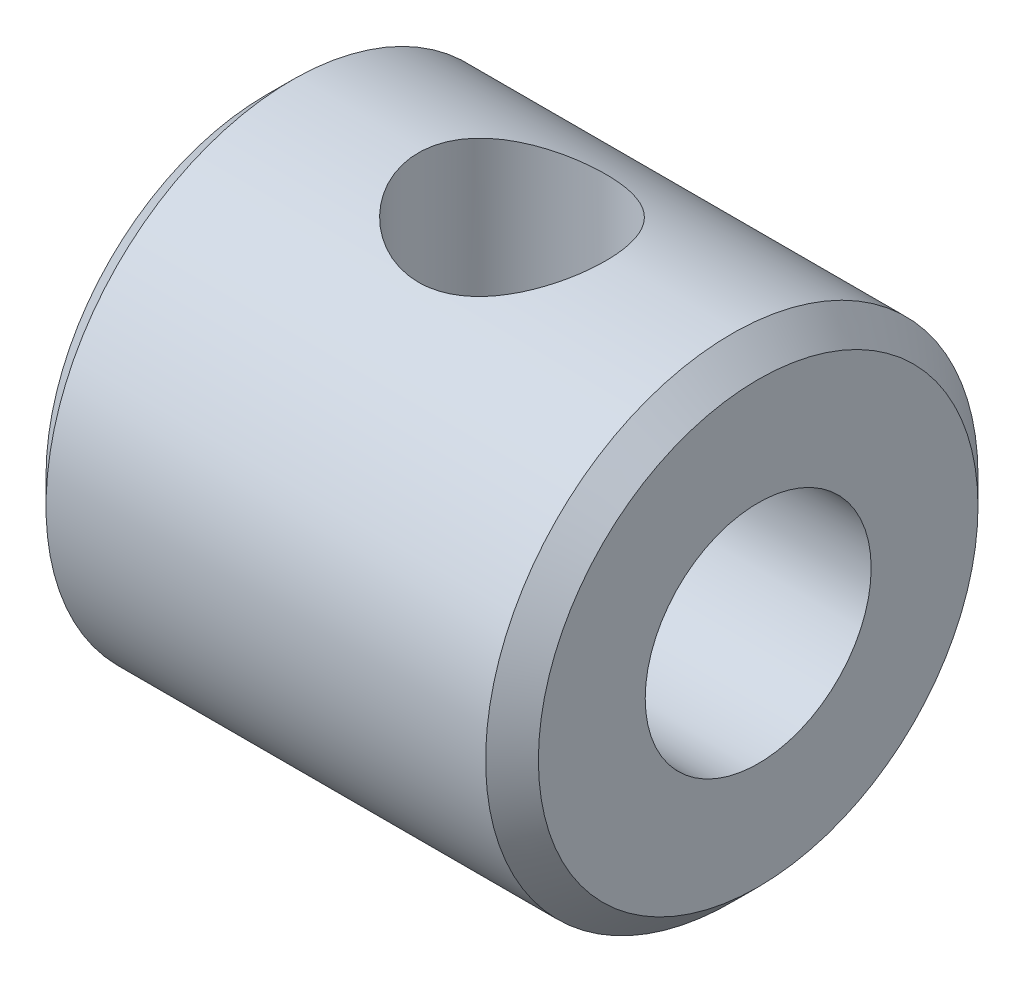
ISO-10303-21;
HEADER;
FILE_DESCRIPTION(('STEP AP214'),'2;1');
FILE_NAME('part.step','',(''),(''),'','','');
FILE_SCHEMA(('AUTOMOTIVE_DESIGN { 1 0 10303 214 1 1 1 1 }'));
ENDSEC;
DATA;
#1=APPLICATION_CONTEXT('core data for automotive mechanical design processes');
#2=APPLICATION_PROTOCOL_DEFINITION('international standard','automotive_design',2000,#1);
#3=PRODUCT_CONTEXT('',#1,'mechanical');
#4=PRODUCT('Part','Part','',(#3));
#5=PRODUCT_RELATED_PRODUCT_CATEGORY('part','',(#4));
#6=PRODUCT_DEFINITION_FORMATION('','',#4);
#7=PRODUCT_DEFINITION_CONTEXT('part definition',#1,'design');
#8=PRODUCT_DEFINITION('design','',#6,#7);
#9=PRODUCT_DEFINITION_SHAPE('','',#8);
#10=(LENGTH_UNIT() NAMED_UNIT(*) SI_UNIT(.MILLI.,.METRE.));
#11=(NAMED_UNIT(*) PLANE_ANGLE_UNIT() SI_UNIT($,.RADIAN.));
#12=(NAMED_UNIT(*) SI_UNIT($,.STERADIAN.) SOLID_ANGLE_UNIT());
#13=UNCERTAINTY_MEASURE_WITH_UNIT(LENGTH_MEASURE(1.E-05),#10,'distance_accuracy_value','');
#14=(GEOMETRIC_REPRESENTATION_CONTEXT(3) GLOBAL_UNCERTAINTY_ASSIGNED_CONTEXT((#13)) GLOBAL_UNIT_ASSIGNED_CONTEXT((#10,
#11,#12)) REPRESENTATION_CONTEXT('',''));
#15=CARTESIAN_POINT('',(0.,0.,0.));
#16=DIRECTION('',(0.,0.,1.));
#17=DIRECTION('',(1.,0.,0.));
#18=AXIS2_PLACEMENT_3D('',#15,#16,#17);
#19=CARTESIAN_POINT('',(3.556,0.,0.));
#20=DIRECTION('',(-1.,0.,0.));
#21=DIRECTION('',(0.,0.,1.));
#22=AXIS2_PLACEMENT_3D('',#19,#20,#21);
#23=CYLINDRICAL_SURFACE('',#22,3.556);
#24=CARTESIAN_POINT('',(0.,3.28872992164149,1.35254999999999));
#25=CARTESIAN_POINT('',(-0.0729579824122121,3.28872695059526,1.35255313314624));
#26=CARTESIAN_POINT('',(-0.145895680043879,3.29118401166729,1.34662729448683));
#27=CARTESIAN_POINT('',(-0.289567009544801,3.30067504056991,1.32319259760194));
#28=CARTESIAN_POINT('',(-0.360300755921839,3.30770877019968,1.30568434220307));
#29=CARTESIAN_POINT('',(-0.497447358802827,3.32544356072862,1.25982422193303));
#30=CARTESIAN_POINT('',(-0.563870370945896,3.33613559999905,1.2314990126039));
#31=CARTESIAN_POINT('',(-0.691047715552462,3.35996754965671,1.16490383505577));
#32=CARTESIAN_POINT('',(-0.751800286437125,3.37310821696071,1.12663079032618));
#33=CARTESIAN_POINT('',(-0.869020751911307,3.40110994617733,1.03912916989911));
#34=CARTESIAN_POINT('',(-0.925157726833985,3.4160226090641,0.989473679776578));
#35=CARTESIAN_POINT('',(-1.02854183272091,3.44545827754911,0.881521788313041));
#36=CARTESIAN_POINT('',(-1.0757869965166,3.45998119631492,0.82322347997704));
#37=CARTESIAN_POINT('',(-1.16165345065754,3.48761662805712,0.697116273528872));
#38=CARTESIAN_POINT('',(-1.19991324398882,3.50066162281356,0.629045109142266));
#39=CARTESIAN_POINT('',(-1.26430016859331,3.5232493773,0.486848376559505));
#40=CARTESIAN_POINT('',(-1.29043163838079,3.53279338913653,0.412724984526264));
#41=CARTESIAN_POINT('',(-1.3286541392425,3.54693737529543,0.264008179304472));
#42=CARTESIAN_POINT('',(-1.34131528122214,3.55173743150153,0.189580695919076));
#43=CARTESIAN_POINT('',(-1.35406634801915,3.55657179918804,0.0395129218120952));
#44=CARTESIAN_POINT('',(-1.35416047829112,3.55660770495503,-0.0361269547169072));
#45=CARTESIAN_POINT('',(-1.34210276547072,3.55203583523694,-0.182378819955788));
#46=CARTESIAN_POINT('',(-1.33057368251982,3.54766421026468,-0.253050828572891));
#47=CARTESIAN_POINT('',(-1.29664684069853,3.53508000848692,-0.391370099550895));
#48=CARTESIAN_POINT('',(-1.27424830983874,3.52686715886458,-0.459017146694801));
#49=CARTESIAN_POINT('',(-1.21893866800888,3.50726101899407,-0.590547449511202));
#50=CARTESIAN_POINT('',(-1.18587799903766,3.49582279179272,-0.654360839460636));
#51=CARTESIAN_POINT('',(-1.11031646110738,3.47091869834099,-0.775694059382025));
#52=CARTESIAN_POINT('',(-1.06781250055986,3.45745216852161,-0.833211819035336));
#53=CARTESIAN_POINT('',(-0.971590202276105,3.42892093469508,-0.943982825907717));
#54=CARTESIAN_POINT('',(-0.917351848875668,3.41380882024151,-0.996772832798935));
#55=CARTESIAN_POINT('',(-0.800707908546607,3.38433116971158,-1.09268563311356));
#56=CARTESIAN_POINT('',(-0.738300154164239,3.36996583318376,-1.13580585274383));
#57=CARTESIAN_POINT('',(-0.60521053786591,3.343304392533,-1.21207575014305));
#58=CARTESIAN_POINT('',(-0.534369197760082,3.33106459280253,-1.2449684255552));
#59=CARTESIAN_POINT('',(-0.387564284333012,3.31069265490561,-1.29818014930753));
#60=CARTESIAN_POINT('',(-0.311603688212201,3.30255815219843,-1.31850643707078));
#61=CARTESIAN_POINT('',(-0.161304337928331,3.29187896773533,-1.34493937195674));
#62=CARTESIAN_POINT('',(-0.0871161424715756,3.28904462476224,-1.35178404108544));
#63=CARTESIAN_POINT('',(0.0613866658488185,3.28846554195145,-1.353193593899));
#64=CARTESIAN_POINT('',(0.13570124075593,3.29071947676155,-1.34776167528672));
#65=CARTESIAN_POINT('',(0.278497753624828,3.29976814229654,-1.32544203591151));
#66=CARTESIAN_POINT('',(0.347086478741951,3.3063330863487,-1.30913341445623));
#67=CARTESIAN_POINT('',(0.480519727709561,3.32298890207836,-1.26625664883574));
#68=CARTESIAN_POINT('',(0.545363467888856,3.33308050864836,-1.2396863662051));
#69=CARTESIAN_POINT('',(0.672220473254277,3.35612592665262,-1.17590104042931));
#70=CARTESIAN_POINT('',(0.734031199368491,3.3691742924343,-1.13831836972097));
#71=CARTESIAN_POINT('',(0.850730185407476,3.39650724247945,-1.0539629457258));
#72=CARTESIAN_POINT('',(0.905615836683541,3.41079228919946,-1.00718674614257));
#73=CARTESIAN_POINT('',(1.01064052162038,3.44012047913077,-0.902145467856401));
#74=CARTESIAN_POINT('',(1.0602325484613,3.45515193244072,-0.843328266313348));
#75=CARTESIAN_POINT('',(1.14891223835705,3.48338528220472,-0.71783966856493));
#76=CARTESIAN_POINT('',(1.18799979293482,3.49658715976451,-0.651168191260643));
#77=CARTESIAN_POINT('',(1.25432441019355,3.51967434566122,-0.511853116838233));
#78=CARTESIAN_POINT('',(1.2815950783198,3.52956904053176,-0.439227163230536));
#79=CARTESIAN_POINT('',(1.32337315487255,3.54495126067496,-0.289954926985211));
#80=CARTESIAN_POINT('',(1.33788675610723,3.55044092421928,-0.213310614194721));
#81=CARTESIAN_POINT('',(1.35305667244368,3.5561865500107,-0.0631143608304707));
#82=CARTESIAN_POINT('',(1.3544893325533,3.55673569793908,0.0103486305844131));
#83=CARTESIAN_POINT('',(1.34546482473822,3.55330863677941,0.156425345057381));
#84=CARTESIAN_POINT('',(1.33500916138407,3.54933300034204,0.229039174409385));
#85=CARTESIAN_POINT('',(1.30305247393023,3.5374396680015,0.369459064823185));
#86=CARTESIAN_POINT('',(1.28184188881098,3.52962578981213,0.437340693875734));
#87=CARTESIAN_POINT('',(1.2292698854812,3.51087563651173,0.568583591589805));
#88=CARTESIAN_POINT('',(1.19790654463925,3.49993877004545,0.631944001290443));
#89=CARTESIAN_POINT('',(1.1244033808017,3.47545365313782,0.755302055679014));
#90=CARTESIAN_POINT('',(1.08186166982509,3.46181406215532,0.815041757893061));
#91=CARTESIAN_POINT('',(0.987836749258811,3.43359234627959,0.926771798966117));
#92=CARTESIAN_POINT('',(0.936350312724715,3.41900988242688,0.978759328490309));
#93=CARTESIAN_POINT('',(0.822553718832394,3.38956658086848,1.07643853084226));
#94=CARTESIAN_POINT('',(0.75980573521733,3.37473410272326,1.12163068245534));
#95=CARTESIAN_POINT('',(0.627139347742529,3.34736338676966,1.20085706712711));
#96=CARTESIAN_POINT('',(0.557219798213377,3.33482551642218,1.23488951374861));
#97=CARTESIAN_POINT('',(0.407930103396707,3.31306723382486,1.2921779589181));
#98=CARTESIAN_POINT('',(0.328249627502346,3.30407299315315,1.31472042905907));
#99=CARTESIAN_POINT('',(0.165702502727777,3.29190810625155,1.34489934042069));
#100=CARTESIAN_POINT('',(0.0828381759410639,3.2887332950359,1.35254644255348));
#101=CARTESIAN_POINT('',(0.,3.28872992164149,1.35254999999999));
#102=B_SPLINE_CURVE_WITH_KNOTS('',3,(#24,#25,#26,#27,#28,#29,#30,#31,#32,#33,#34,#35,#36,#37,
#38,#39,#40,#41,#42,#43,#44,#45,#46,#47,#48,#49,#50,#51,#52,#53,#54,#55,#56,#57,#58,#59,#60,#61,
#62,#63,#64,#65,#66,#67,#68,#69,#70,#71,#72,#73,#74,#75,#76,#77,#78,#79,#80,#81,#82,#83,#84,#85,
#86,#87,#88,#89,#90,#91,#92,#93,#94,#95,#96,#97,#98,#99,#100,#101),.UNSPECIFIED.,.T.,.F.,(4,2,2,
2,2,2,2,2,2,2,2,2,2,2,2,2,2,2,2,2,2,2,2,2,2,2,2,2,2,2,2,2,2,2,2,2,2,2,4),(0.,0.218565255395777,
0.437119136085718,0.655137887607369,0.873224144944074,1.10145843592077,1.32974316081928,
1.56605200587381,1.80227625383015,2.0280478095752,2.25374381240202,2.46795771773168,
2.6821868395721,2.89956215493319,3.11700874077098,3.34750807274501,3.57806868376154,
3.81402596637908,4.04984718839589,4.27235442190941,4.49480370528014,4.7062653510228,
4.91777108783696,5.13735070063512,5.35701278282329,5.59107432574855,5.82513828567614,
6.05853216319278,6.29181267899035,6.51115109268986,6.73046175029835,6.94414242266398,
7.1578635835191,7.38068206155404,7.60358109227305,7.83866500712561,8.07378653568479,
8.32212837628856,8.57029240827594),.UNSPECIFIED.);
#103=CARTESIAN_POINT('',(0.,3.28872992164149,1.35254999999999));
#104=VERTEX_POINT('',#103);
#105=EDGE_CURVE('E90',#104,#104,#102,.T.);
#106=ORIENTED_EDGE('',*,*,#105,.T.);
#107=EDGE_LOOP('',(#106));
#108=FACE_BOUND('',#107,.T.);
#109=CARTESIAN_POINT('',(-0.444499999999994,-3.556,0.));
#110=CARTESIAN_POINT('',(-0.444498943701623,-3.55599965310585,0.024863746789814));
#111=CARTESIAN_POINT('',(-0.442406782083695,-3.55573647293861,0.0497430303110277));
#112=CARTESIAN_POINT('',(-0.434093765237306,-3.554711910318,0.0988092922115566));
#113=CARTESIAN_POINT('',(-0.427868599037215,-3.55395000767886,0.1229955201849));
#114=CARTESIAN_POINT('',(-0.41147584691207,-3.55201383253695,0.169958233201759));
#115=CARTESIAN_POINT('',(-0.401310914606202,-3.55083983764795,0.19273565519398));
#116=CARTESIAN_POINT('',(-0.377332976910165,-3.54821005016126,0.236256990635978));
#117=CARTESIAN_POINT('',(-0.363520597323233,-3.54675430591556,0.257001252084719));
#118=CARTESIAN_POINT('',(-0.332558551318516,-3.54371459128265,0.295985938850384));
#119=CARTESIAN_POINT('',(-0.315392818402234,-3.54213002592312,0.314213558885816));
#120=CARTESIAN_POINT('',(-0.278245829975181,-3.53901605684534,0.347537266694517));
#121=CARTESIAN_POINT('',(-0.258264431034421,-3.53748665594215,0.362633194842537));
#122=CARTESIAN_POINT('',(-0.215970107988822,-3.53465031939162,0.389312686676279));
#123=CARTESIAN_POINT('',(-0.193649561113217,-3.53334415002233,0.400884254658317));
#124=CARTESIAN_POINT('',(-0.147362942163757,-3.53111000639776,0.42010994301505));
#125=CARTESIAN_POINT('',(-0.123396932529259,-3.53018201780116,0.427764211943989));
#126=CARTESIAN_POINT('',(-0.0746325820246721,-3.52881498381523,0.438899118648397));
#127=CARTESIAN_POINT('',(-0.0498392499801937,-3.52837340655053,0.44240137587929));
#128=CARTESIAN_POINT('',(-1.31103547080831E-05,-3.52802144203788,0.445199740711269));
#129=CARTESIAN_POINT('',(0.0250196875556231,-3.52811103342868,0.444496017458223));
#130=CARTESIAN_POINT('',(0.0744634982848323,-3.52880896664742,0.438920144640431));
#131=CARTESIAN_POINT('',(0.0988772445464053,-3.52941434469346,0.434071810058673));
#132=CARTESIAN_POINT('',(0.146541874772734,-3.53107101716906,0.420381498129763));
#133=CARTESIAN_POINT('',(0.169792735166154,-3.5321223206333,0.411539439867482));
#134=CARTESIAN_POINT('',(0.214545570226053,-3.53455574800735,0.390087076552286));
#135=CARTESIAN_POINT('',(0.236042532784266,-3.53593877836995,0.377466422509212));
#136=CARTESIAN_POINT('',(0.276622430266671,-3.5388791249236,0.348822525269435));
#137=CARTESIAN_POINT('',(0.295705254710116,-3.54043644908491,0.332799126439157));
#138=CARTESIAN_POINT('',(0.331053413966499,-3.54356308538518,0.297672601892018));
#139=CARTESIAN_POINT('',(0.347298356515986,-3.54513240596389,0.27854894899395));
#140=CARTESIAN_POINT('',(0.376350838869426,-3.54809613668431,0.237835444668452));
#141=CARTESIAN_POINT('',(0.389158370747076,-3.54949054642268,0.216245587554382));
#142=CARTESIAN_POINT('',(0.410972488778478,-3.55194820864463,0.171196805168424));
#143=CARTESIAN_POINT('',(0.419977798020076,-3.55301134984593,0.147737255131044));
#144=CARTESIAN_POINT('',(0.433915653748428,-3.55468567711695,0.0996227518086404));
#145=CARTESIAN_POINT('',(0.438848390905961,-3.5552968843453,0.0749678545449316));
#146=CARTESIAN_POINT('',(0.44447465003352,-3.55599572641833,0.0253388405438195));
#147=CARTESIAN_POINT('',(0.445196263442325,-3.5560868306616,0.000367955357312362));
#148=CARTESIAN_POINT('',(0.442453924884846,-3.55574456897365,-0.049338795289254));
#149=CARTESIAN_POINT('',(0.438990062054661,-3.55531121421158,-0.0740746657430037));
#150=CARTESIAN_POINT('',(0.427998433779908,-3.5539708908494,-0.122526337472885));
#151=CARTESIAN_POINT('',(0.420484062667006,-3.55306548356706,-0.14624522422151));
#152=CARTESIAN_POINT('',(0.401618649049877,-3.55088242367215,-0.192086168633822));
#153=CARTESIAN_POINT('',(0.390267476272219,-3.54960475842027,-0.21420817204653));
#154=CARTESIAN_POINT('',(0.363982712151169,-3.54681098113418,-0.256352843778221));
#155=CARTESIAN_POINT('',(0.349030949672553,-3.54529367350758,-0.276364098518007));
#156=CARTESIAN_POINT('',(0.315995139338414,-3.54219408305502,-0.313603104755555));
#157=CARTESIAN_POINT('',(0.29791096714977,-3.54061179765183,-0.330830745712289));
#158=CARTESIAN_POINT('',(0.258999941300577,-3.53754988151247,-0.362113162277838));
#159=CARTESIAN_POINT('',(0.238158060026009,-3.53607088645452,-0.376149316888973));
#160=CARTESIAN_POINT('',(0.19439616406483,-3.53339346082405,-0.400521683743049));
#161=CARTESIAN_POINT('',(0.171476191049073,-3.53219502462737,-0.410857970156898));
#162=CARTESIAN_POINT('',(0.124268808255553,-3.53021873399875,-0.427507045722465));
#163=CARTESIAN_POINT('',(0.0999851490174692,-3.52943978293855,-0.433830333561868));
#164=CARTESIAN_POINT('',(0.0506903383837968,-3.52838751048345,-0.442307724909697));
#165=CARTESIAN_POINT('',(0.0256792208864892,-3.52811416556641,-0.444462022370852));
#166=CARTESIAN_POINT('',(-0.0241752756125915,-3.52810473927481,-0.444536722115878));
#167=CARTESIAN_POINT('',(-0.049018615153409,-3.52836494560897,-0.442486379030925));
#168=CARTESIAN_POINT('',(-0.0980046275975534,-3.52938532164714,-0.434271949182204));
#169=CARTESIAN_POINT('',(-0.122147300425802,-3.53014549140472,-0.42810786197764));
#170=CARTESIAN_POINT('',(-0.169042808913063,-3.53207899384715,-0.411850065702015));
#171=CARTESIAN_POINT('',(-0.191796139524876,-3.53325217837597,-0.401757765616626));
#172=CARTESIAN_POINT('',(-0.235291035089787,-3.53587976660929,-0.37793290720232));
#173=CARTESIAN_POINT('',(-0.256032574830922,-3.53733417383741,-0.3642003032608));
#174=CARTESIAN_POINT('',(-0.295064651865532,-3.54037245524947,-0.333376125699061));
#175=CARTESIAN_POINT('',(-0.313337910957791,-3.54195712856541,-0.316262750262783));
#176=CARTESIAN_POINT('',(-0.346764553514861,-3.54507033457218,-0.279208270354974));
#177=CARTESIAN_POINT('',(-0.361917200355668,-3.546598853938,-0.259266500109367));
#178=CARTESIAN_POINT('',(-0.388721536493316,-3.54943394661123,-0.217034347387875));
#179=CARTESIAN_POINT('',(-0.400359693088882,-3.55073965378922,-0.194735321912196));
#180=CARTESIAN_POINT('',(-0.419709566990509,-3.55297322005842,-0.148495520029165));
#181=CARTESIAN_POINT('',(-0.427425550645639,-3.5539014894871,-0.124556559778726));
#182=CARTESIAN_POINT('',(-0.436865150326852,-3.55505182874273,-0.0837448262558958));
#183=CARTESIAN_POINT('',(-0.439724103884405,-3.55540566064212,-0.0671293969733075));
#184=CARTESIAN_POINT('',(-0.443541879484249,-3.5558798629033,-0.0336783538391704));
#185=CARTESIAN_POINT('',(-0.44450071553819,-3.55600023498665,-0.0168427416121934));
#186=CARTESIAN_POINT('',(-0.444499999999994,-3.556,0.));
#187=B_SPLINE_CURVE_WITH_KNOTS('',3,(#109,#110,#111,#112,#113,#114,#115,#116,#117,#118,#119,
#120,#121,#122,#123,#124,#125,#126,#127,#128,#129,#130,#131,#132,#133,#134,#135,#136,#137,#138,
#139,#140,#141,#142,#143,#144,#145,#146,#147,#148,#149,#150,#151,#152,#153,#154,#155,#156,#157,
#158,#159,#160,#161,#162,#163,#164,#165,#166,#167,#168,#169,#170,#171,#172,#173,#174,#175,#176,
#177,#178,#179,#180,#181,#182,#183,#184,#185,#186),.UNSPECIFIED.,.T.,.F.,(4,2,2,2,2,2,2,2,2,2,2,
2,2,2,2,2,2,2,2,2,2,2,2,2,2,2,2,2,2,2,2,2,2,2,2,2,2,2,4),(0.,0.0745297190996156,
0.149137299555739,0.223694715354715,0.298239347420924,0.373150305872871,0.448065081668412,
0.523232063066942,0.598396193725314,0.673167202559069,0.747935204454921,0.822276454273317,
0.896619210355564,0.971167471935664,1.04571914391323,1.12078626412653,1.1958535574351,
1.27094604081078,1.3460350082869,1.42062249675882,1.49520839680441,1.56954915382244,
1.64389243523435,1.71861907240671,1.79334867634488,1.86850370534044,1.94365722762587,
2.01861331607146,2.09356591727286,2.16799879033751,2.2424316713778,2.3168378791281,
2.39124501922397,2.46614865261604,2.54106994687965,2.61627615459949,2.69140038066017,
2.74188730318756,2.79237385341814),.UNSPECIFIED.);
#188=CARTESIAN_POINT('',(-0.444499999999994,-3.556,0.));
#189=VERTEX_POINT('',#188);
#190=EDGE_CURVE('E10',#189,#189,#187,.T.);
#191=ORIENTED_EDGE('',*,*,#190,.T.);
#192=EDGE_LOOP('',(#191));
#193=FACE_BOUND('',#192,.T.);
#194=CARTESIAN_POINT('',(-3.175,0.,0.));
#195=DIRECTION('',(1.,0.,0.));
#196=DIRECTION('',(0.,0.,-1.));
#197=AXIS2_PLACEMENT_3D('',#194,#195,#196);
#198=CIRCLE('',#197,3.556);
#199=CARTESIAN_POINT('',(-3.175,0.,-3.556));
#200=VERTEX_POINT('',#199);
#201=EDGE_CURVE('E106',#200,#200,#198,.T.);
#202=ORIENTED_EDGE('',*,*,#201,.T.);
#203=EDGE_LOOP('',(#202));
#204=FACE_BOUND('',#203,.T.);
#205=CARTESIAN_POINT('',(3.17499999999999,0.,0.));
#206=DIRECTION('',(1.,0.,0.));
#207=DIRECTION('',(0.,0.,-1.));
#208=AXIS2_PLACEMENT_3D('',#205,#206,#207);
#209=CIRCLE('',#208,3.556);
#210=CARTESIAN_POINT('',(3.17499999999999,0.,-3.556));
#211=VERTEX_POINT('',#210);
#212=EDGE_CURVE('E103',#211,#211,#209,.F.);
#213=ORIENTED_EDGE('',*,*,#212,.T.);
#214=EDGE_LOOP('',(#213));
#215=FACE_BOUND('',#214,.T.);
#216=ADVANCED_FACE('F35',(#108,#193,#204,#215),#23,.T.);
#217=CARTESIAN_POINT('',(3.556,0.,0.));
#218=DIRECTION('',(1.,0.,0.));
#219=DIRECTION('',(0.,0.,-1.));
#220=AXIS2_PLACEMENT_3D('',#217,#218,#219);
#221=PLANE('',#220);
#222=CARTESIAN_POINT('',(3.556,0.,0.));
#223=DIRECTION('',(1.,0.,0.));
#224=DIRECTION('',(0.,0.,-1.));
#225=AXIS2_PLACEMENT_3D('',#222,#223,#224);
#226=CIRCLE('',#225,3.175);
#227=CARTESIAN_POINT('',(3.556,0.,-3.175));
#228=VERTEX_POINT('',#227);
#229=EDGE_CURVE('E47',#228,#228,#226,.T.);
#230=ORIENTED_EDGE('',*,*,#229,.T.);
#231=EDGE_LOOP('',(#230));
#232=FACE_BOUND('',#231,.T.);
#233=CARTESIAN_POINT('',(3.556,0.,0.));
#234=DIRECTION('',(1.,0.,0.));
#235=DIRECTION('',(0.,0.,-1.));
#236=AXIS2_PLACEMENT_3D('',#233,#234,#235);
#237=CIRCLE('',#236,1.63194999999999);
#238=CARTESIAN_POINT('',(3.556,0.,-1.63194999999999));
#239=VERTEX_POINT('',#238);
#240=EDGE_CURVE('E96',#239,#239,#237,.T.);
#241=ORIENTED_EDGE('',*,*,#240,.F.);
#242=EDGE_LOOP('',(#241));
#243=FACE_BOUND('',#242,.T.);
#244=ADVANCED_FACE('F76',(#232,#243),#221,.T.);
#245=CARTESIAN_POINT('',(-3.556,0.,0.));
#246=DIRECTION('',(1.,0.,0.));
#247=DIRECTION('',(0.,0.,-1.));
#248=AXIS2_PLACEMENT_3D('',#245,#246,#247);
#249=PLANE('',#248);
#250=CARTESIAN_POINT('',(-3.556,0.,0.));
#251=DIRECTION('',(1.,0.,0.));
#252=DIRECTION('',(0.,0.,-1.));
#253=AXIS2_PLACEMENT_3D('',#250,#251,#252);
#254=CIRCLE('',#253,3.175);
#255=CARTESIAN_POINT('',(-3.556,0.,-3.175));
#256=VERTEX_POINT('',#255);
#257=EDGE_CURVE('E52',#256,#256,#254,.F.);
#258=ORIENTED_EDGE('',*,*,#257,.T.);
#259=EDGE_LOOP('',(#258));
#260=FACE_BOUND('',#259,.T.);
#261=CARTESIAN_POINT('',(-3.556,0.,0.));
#262=DIRECTION('',(1.,0.,0.));
#263=DIRECTION('',(0.,0.,-1.));
#264=AXIS2_PLACEMENT_3D('',#261,#262,#263);
#265=CIRCLE('',#264,1.63195);
#266=CARTESIAN_POINT('',(-3.556,0.,-1.63195));
#267=VERTEX_POINT('',#266);
#268=EDGE_CURVE('E100',#267,#267,#265,.T.);
#269=ORIENTED_EDGE('',*,*,#268,.T.);
#270=EDGE_LOOP('',(#269));
#271=FACE_BOUND('',#270,.T.);
#272=ADVANCED_FACE('F74',(#260,#271),#249,.F.);
#273=CARTESIAN_POINT('',(3.556,0.,0.));
#274=DIRECTION('',(1.,0.,0.));
#275=DIRECTION('',(0.,0.,-1.));
#276=AXIS2_PLACEMENT_3D('',#273,#274,#275);
#277=CYLINDRICAL_SURFACE('',#276,1.63194999999999);
#278=CARTESIAN_POINT('',(0.,-0.913164443022173,1.35254999999999));
#279=CARTESIAN_POINT('',(-0.0482129648129089,-0.913174218112552,1.35254618358473));
#280=CARTESIAN_POINT('',(-0.0965013114643195,-0.917065762812552,1.34994037250798));
#281=CARTESIAN_POINT('',(-0.191500156574022,-0.931831713657894,1.33978475884243));
#282=CARTESIAN_POINT('',(-0.238205076893271,-0.942728552461204,1.33221907198011));
#283=CARTESIAN_POINT('',(-0.346479926352559,-0.974835158928112,1.30899796707554));
#284=CARTESIAN_POINT('',(-0.406904801943556,-0.998395127931129,1.291355388304));
#285=CARTESIAN_POINT('',(-0.522730508681883,-1.0509215712246,1.24898795759959));
#286=CARTESIAN_POINT('',(-0.578114225961026,-1.07990551078012,1.22424008498922));
#287=CARTESIAN_POINT('',(-0.707102359334011,-1.15322926583538,1.1561930575366));
#288=CARTESIAN_POINT('',(-0.778229364472051,-1.19878952749589,1.10949952437686));
#289=CARTESIAN_POINT('',(-0.910897515096329,-1.28890553720001,1.00341704647739));
#290=CARTESIAN_POINT('',(-0.972447594942514,-1.3334621879169,0.944040058425255));
#291=CARTESIAN_POINT('',(-1.07286966751182,-1.40856849929045,0.826433551863238));
#292=CARTESIAN_POINT('',(-1.11378937908601,-1.44009420397599,0.77058399212111));
#293=CARTESIAN_POINT('',(-1.18748351805466,-1.49781902650109,0.651284184684986));
#294=CARTESIAN_POINT('',(-1.22027103988618,-1.52402669489149,0.587846402957037));
#295=CARTESIAN_POINT('',(-1.27123717753742,-1.56516115487034,0.465769481637182));
#296=CARTESIAN_POINT('',(-1.29095620164916,-1.58125133748324,0.408169881251655));
#297=CARTESIAN_POINT('',(-1.32262413072651,-1.60720900485322,0.289514764738237));
#298=CARTESIAN_POINT('',(-1.33457746040277,-1.61708003304166,0.228461238173433));
#299=CARTESIAN_POINT('',(-1.34997820013033,-1.62981329634165,0.104295371306488));
#300=CARTESIAN_POINT('',(-1.35339083520254,-1.63264687685968,0.0411756706259302));
#301=CARTESIAN_POINT('',(-1.35135705841914,-1.63096130551535,-0.0848201665132791));
#302=CARTESIAN_POINT('',(-1.34591095443569,-1.62644240917727,-0.147696311360225));
#303=CARTESIAN_POINT('',(-1.32719445888212,-1.61099013952601,-0.26714017378067));
#304=CARTESIAN_POINT('',(-1.31445875179149,-1.60049534025964,-0.323851602397685));
#305=CARTESIAN_POINT('',(-1.28230374245191,-1.57419403850359,-0.434033982704517));
#306=CARTESIAN_POINT('',(-1.26288265438579,-1.55838611678486,-0.487504064063843));
#307=CARTESIAN_POINT('',(-1.21625236997154,-1.52083232267124,-0.594845193996291));
#308=CARTESIAN_POINT('',(-1.18851087265927,-1.49868824557923,-0.648342896285025));
#309=CARTESIAN_POINT('',(-1.12717433337063,-1.45052778135446,-0.74993033903664));
#310=CARTESIAN_POINT('',(-1.09357691702145,-1.42450982412326,-0.79801787279885));
#311=CARTESIAN_POINT('',(-1.01385986645081,-1.36417100543984,-0.897983901840891));
#312=CARTESIAN_POINT('',(-0.966588554935555,-1.32924770973984,-0.948577369413004));
#313=CARTESIAN_POINT('',(-0.865582240619776,-1.25770551837544,-1.04157745183658));
#314=CARTESIAN_POINT('',(-0.81183692494022,-1.2210839760791,-1.08397071651853));
#315=CARTESIAN_POINT('',(-0.698177983276693,-1.14864643157874,-1.1604492529639));
#316=CARTESIAN_POINT('',(-0.638260610930617,-1.11283093489536,-1.19452943602039));
#317=CARTESIAN_POINT('',(-0.511942446371397,-1.04551201752233,-1.25385758139809));
#318=CARTESIAN_POINT('',(-0.445556447880592,-1.01399913580277,-1.27912511860905));
#319=CARTESIAN_POINT('',(-0.332497851424528,-0.97100001803872,-1.31181467992364));
#320=CARTESIAN_POINT('',(-0.287921183892917,-0.956454229653942,-1.3223693275492));
#321=CARTESIAN_POINT('',(-0.196536728277217,-0.933036871580605,-1.33899622108067));
#322=CARTESIAN_POINT('',(-0.149735042863199,-0.924150646301967,-1.34508005063371));
#323=CARTESIAN_POINT('',(-0.0544477453564147,-0.913556589996322,-1.35230302441981));
#324=CARTESIAN_POINT('',(-0.00595048552393776,-0.911916604296992,-1.35339543808394));
#325=CARTESIAN_POINT('',(0.0905379338379833,-0.916370085545947,-1.35038173172752));
#326=CARTESIAN_POINT('',(0.138528578190432,-0.92247077920536,-1.34627075382067));
#327=CARTESIAN_POINT('',(0.240727509560639,-0.942802056953501,-1.33212466964305));
#328=CARTESIAN_POINT('',(0.294550583700535,-0.958270566806631,-1.32117722166397));
#329=CARTESIAN_POINT('',(0.398611963931876,-0.995175468472279,-1.29360609421027));
#330=CARTESIAN_POINT('',(0.448837931050406,-1.01663127132721,-1.27696391179267));
#331=CARTESIAN_POINT('',(0.573392968140573,-1.07616926532543,-1.22773357495732));
#332=CARTESIAN_POINT('',(0.645063364528228,-1.1167387824477,-1.19147054248799));
#333=CARTESIAN_POINT('',(0.780190258716219,-1.19990214973378,-1.10770716018455));
#334=CARTESIAN_POINT('',(0.843633471251842,-1.2424991258951,-1.06018897675796));
#335=CARTESIAN_POINT('',(0.964100507456188,-1.32720473386092,-0.952190513532595));
#336=CARTESIAN_POINT('',(1.02082348158087,-1.36924458616324,-0.891316144811316));
#337=CARTESIAN_POINT('',(1.12343389876362,-1.44736984423681,-0.757843190532235));
#338=CARTESIAN_POINT('',(1.16935227019232,-1.4834721547658,-0.685279096892184));
#339=CARTESIAN_POINT('',(1.23583514216633,-1.53651930605198,-0.552998764078327));
#340=CARTESIAN_POINT('',(1.25986839397281,-1.55595682897042,-0.496022929538223));
#341=CARTESIAN_POINT('',(1.30022844630794,-1.58881232529899,-0.377744884505309));
#342=CARTESIAN_POINT('',(1.3165610436749,-1.60223482627187,-0.316445968398058));
#343=CARTESIAN_POINT('',(1.34058179063071,-1.62203024322005,-0.190661578861317));
#344=CARTESIAN_POINT('',(1.34821950392599,-1.6283620247396,-0.126159755865751));
#345=CARTESIAN_POINT('',(1.35410107797688,-1.63323478168753,0.0035649558936974));
#346=CARTESIAN_POINT('',(1.35234735553533,-1.63177776149524,0.0687876548354176));
#347=CARTESIAN_POINT('',(1.34017327361763,-1.62170409940724,0.191848393424844));
#348=CARTESIAN_POINT('',(1.33054648299588,-1.61374310177331,0.249823055468025));
#349=CARTESIAN_POINT('',(1.30422087043645,-1.59210720770382,0.363012162183523));
#350=CARTESIAN_POINT('',(1.28752100136876,-1.578431465236,0.418226196806532));
#351=CARTESIAN_POINT('',(1.24684466008414,-1.545426100675,0.527588578119412));
#352=CARTESIAN_POINT('',(1.22253719589461,-1.52584116336651,0.581534944541339));
#353=CARTESIAN_POINT('',(1.16800234694675,-1.48250664026528,0.684516677879001));
#354=CARTESIAN_POINT('',(1.13777127359931,-1.45875446052945,0.733548955924691));
#355=CARTESIAN_POINT('',(1.05692066975656,-1.39642467046519,0.84809619361649));
#356=CARTESIAN_POINT('',(1.00337516550146,-1.35610589639712,0.910606313497642));
#357=CARTESIAN_POINT('',(0.887114096638708,-1.27247295005049,1.02423644068794));
#358=CARTESIAN_POINT('',(0.824376024778181,-1.22915156739344,1.07532769143805));
#359=CARTESIAN_POINT('',(0.700000502098644,-1.14974488403933,1.15939276240923));
#360=CARTESIAN_POINT('',(0.639495055166672,-1.11351268346204,1.19391394566702));
#361=CARTESIAN_POINT('',(0.511884872538281,-1.04545766478041,1.25391986308938));
#362=CARTESIAN_POINT('',(0.444799509063023,-1.01362253018336,1.27943016338579));
#363=CARTESIAN_POINT('',(0.329829088033452,-0.970041976547969,1.31253066089555));
#364=CARTESIAN_POINT('',(0.284034665522938,-0.955222821784468,1.3232585947229));
#365=CARTESIAN_POINT('',(0.19013127810633,-0.93165564510449,1.33995991215895));
#366=CARTESIAN_POINT('',(0.142032073305152,-0.922884089035281,1.34595173975863));
#367=CARTESIAN_POINT('',(0.0779237992928178,-0.916351570637316,1.35039358390785));
#368=CARTESIAN_POINT('',(0.062377768043024,-0.915160577155311,1.35120061427735));
#369=CARTESIAN_POINT('',(0.0312238032621306,-0.913565335117073,1.35227950512872));
#370=CARTESIAN_POINT('',(0.0156158556671148,-0.913161276936016,1.35255123611128));
#371=CARTESIAN_POINT('',(0.,-0.913164443022173,1.35254999999999));
#372=B_SPLINE_CURVE_WITH_KNOTS('',3,(#278,#279,#280,#281,#282,#283,#284,#285,#286,#287,#288,
#289,#290,#291,#292,#293,#294,#295,#296,#297,#298,#299,#300,#301,#302,#303,#304,#305,#306,#307,
#308,#309,#310,#311,#312,#313,#314,#315,#316,#317,#318,#319,#320,#321,#322,#323,#324,#325,#326,
#327,#328,#329,#330,#331,#332,#333,#334,#335,#336,#337,#338,#339,#340,#341,#342,#343,#344,#345,
#346,#347,#348,#349,#350,#351,#352,#353,#354,#355,#356,#357,#358,#359,#360,#361,#362,#363,#364,
#365,#366,#367,#368,#369,#370,#371),.UNSPECIFIED.,.T.,.F.,(4,2,2,2,2,2,2,2,2,2,2,2,2,2,2,2,2,2,
2,2,2,2,2,2,2,2,2,2,2,2,2,2,2,2,2,2,2,2,2,2,2,2,2,2,2,2,4),(0.,0.144569286517668,
0.289603840816413,0.490098103929609,0.691249430694971,0.97938510346167,1.26725034022997,
1.49463481842344,1.72165075025827,1.90977820949582,2.09779838388901,2.28658287988016,
2.47536081509004,2.65179970099325,2.82828575435199,3.02019561746505,3.21218347518441,
3.44402286433577,3.67623657534871,3.90859207718851,4.14042812756673,4.28415980881973,
4.42751776328662,4.57221514814865,4.71704772218288,4.88727502717507,5.05806075915036,
5.32659997574819,5.59556756854329,5.87391068231086,6.15144706808513,6.34514667597456,
6.53870023846791,6.7333709133362,6.9279914938377,7.10510995122076,7.28225463917909,
7.46853947159144,7.6549406729984,7.92844749334959,8.20263552355159,8.43750961901017,
8.67171186143928,8.81917654482274,8.96606408215922,9.01287777987105,9.05970280133401),.UNSPECIFIED.);
#373=CARTESIAN_POINT('',(0.,-0.913164443022173,1.35254999999999));
#374=VERTEX_POINT('',#373);
#375=EDGE_CURVE('E39',#374,#374,#372,.T.);
#376=ORIENTED_EDGE('',*,*,#375,.T.);
#377=EDGE_LOOP('',(#376));
#378=FACE_BOUND('',#377,.T.);
#379=CARTESIAN_POINT('',(0.,0.913164443022173,1.35254999999999));
#380=CARTESIAN_POINT('',(0.0482129648129089,0.913174218112552,1.35254618358473));
#381=CARTESIAN_POINT('',(0.0965013114643195,0.917065762812552,1.34994037250798));
#382=CARTESIAN_POINT('',(0.191500156574022,0.931831713657894,1.33978475884243));
#383=CARTESIAN_POINT('',(0.238205076893271,0.942728552461204,1.33221907198011));
#384=CARTESIAN_POINT('',(0.346479926352559,0.974835158928112,1.30899796707554));
#385=CARTESIAN_POINT('',(0.406904801943556,0.998395127931129,1.291355388304));
#386=CARTESIAN_POINT('',(0.522730508681883,1.0509215712246,1.24898795759959));
#387=CARTESIAN_POINT('',(0.578114225961026,1.07990551078012,1.22424008498922));
#388=CARTESIAN_POINT('',(0.707102359334011,1.15322926583538,1.1561930575366));
#389=CARTESIAN_POINT('',(0.778229364472051,1.19878952749589,1.10949952437686));
#390=CARTESIAN_POINT('',(0.910897515096329,1.28890553720001,1.00341704647739));
#391=CARTESIAN_POINT('',(0.972447594942514,1.3334621879169,0.944040058425255));
#392=CARTESIAN_POINT('',(1.07286966751182,1.40856849929045,0.826433551863238));
#393=CARTESIAN_POINT('',(1.11378937908601,1.44009420397599,0.77058399212111));
#394=CARTESIAN_POINT('',(1.18748351805466,1.49781902650109,0.651284184684986));
#395=CARTESIAN_POINT('',(1.22027103988618,1.52402669489149,0.587846402957037));
#396=CARTESIAN_POINT('',(1.27123717753742,1.56516115487034,0.465769481637182));
#397=CARTESIAN_POINT('',(1.29095620164916,1.58125133748324,0.408169881251655));
#398=CARTESIAN_POINT('',(1.32262413072651,1.60720900485322,0.289514764738237));
#399=CARTESIAN_POINT('',(1.33457746040277,1.61708003304166,0.228461238173433));
#400=CARTESIAN_POINT('',(1.34997820013033,1.62981329634165,0.104295371306488));
#401=CARTESIAN_POINT('',(1.35339083520254,1.63264687685968,0.0411756706259302));
#402=CARTESIAN_POINT('',(1.35135705841914,1.63096130551535,-0.0848201665132791));
#403=CARTESIAN_POINT('',(1.34591095443569,1.62644240917727,-0.147696311360225));
#404=CARTESIAN_POINT('',(1.32719445888212,1.61099013952601,-0.26714017378067));
#405=CARTESIAN_POINT('',(1.31445875179149,1.60049534025964,-0.323851602397685));
#406=CARTESIAN_POINT('',(1.28230374245191,1.57419403850359,-0.434033982704517));
#407=CARTESIAN_POINT('',(1.26288265438579,1.55838611678486,-0.487504064063843));
#408=CARTESIAN_POINT('',(1.21625236997154,1.52083232267124,-0.594845193996291));
#409=CARTESIAN_POINT('',(1.18851087265927,1.49868824557923,-0.648342896285025));
#410=CARTESIAN_POINT('',(1.12717433337063,1.45052778135446,-0.74993033903664));
#411=CARTESIAN_POINT('',(1.09357691702145,1.42450982412326,-0.79801787279885));
#412=CARTESIAN_POINT('',(1.01385986645081,1.36417100543984,-0.897983901840891));
#413=CARTESIAN_POINT('',(0.966588554935555,1.32924770973984,-0.948577369413004));
#414=CARTESIAN_POINT('',(0.865582240619776,1.25770551837544,-1.04157745183658));
#415=CARTESIAN_POINT('',(0.81183692494022,1.2210839760791,-1.08397071651853));
#416=CARTESIAN_POINT('',(0.698177983276693,1.14864643157874,-1.1604492529639));
#417=CARTESIAN_POINT('',(0.638260610930617,1.11283093489536,-1.19452943602039));
#418=CARTESIAN_POINT('',(0.511942446371397,1.04551201752233,-1.25385758139809));
#419=CARTESIAN_POINT('',(0.445556447880592,1.01399913580277,-1.27912511860905));
#420=CARTESIAN_POINT('',(0.332497851424528,0.97100001803872,-1.31181467992364));
#421=CARTESIAN_POINT('',(0.287921183892917,0.956454229653942,-1.3223693275492));
#422=CARTESIAN_POINT('',(0.196536728277217,0.933036871580605,-1.33899622108067));
#423=CARTESIAN_POINT('',(0.149735042863199,0.924150646301967,-1.34508005063371));
#424=CARTESIAN_POINT('',(0.0544477453564147,0.913556589996322,-1.35230302441981));
#425=CARTESIAN_POINT('',(0.00595048552393776,0.911916604296992,-1.35339543808394));
#426=CARTESIAN_POINT('',(-0.0905379338379833,0.916370085545947,-1.35038173172752));
#427=CARTESIAN_POINT('',(-0.138528578190432,0.92247077920536,-1.34627075382067));
#428=CARTESIAN_POINT('',(-0.240727509560639,0.942802056953501,-1.33212466964305));
#429=CARTESIAN_POINT('',(-0.294550583700535,0.958270566806631,-1.32117722166397));
#430=CARTESIAN_POINT('',(-0.398611963931876,0.995175468472279,-1.29360609421027));
#431=CARTESIAN_POINT('',(-0.448837931050406,1.01663127132721,-1.27696391179267));
#432=CARTESIAN_POINT('',(-0.573392968140573,1.07616926532543,-1.22773357495732));
#433=CARTESIAN_POINT('',(-0.645063364528228,1.1167387824477,-1.19147054248799));
#434=CARTESIAN_POINT('',(-0.780190258716219,1.19990214973378,-1.10770716018455));
#435=CARTESIAN_POINT('',(-0.843633471251842,1.2424991258951,-1.06018897675796));
#436=CARTESIAN_POINT('',(-0.964100507456188,1.32720473386092,-0.952190513532595));
#437=CARTESIAN_POINT('',(-1.02082348158087,1.36924458616324,-0.891316144811316));
#438=CARTESIAN_POINT('',(-1.12343389876362,1.44736984423681,-0.757843190532235));
#439=CARTESIAN_POINT('',(-1.16935227019232,1.4834721547658,-0.685279096892184));
#440=CARTESIAN_POINT('',(-1.23583514216633,1.53651930605198,-0.552998764078327));
#441=CARTESIAN_POINT('',(-1.25986839397281,1.55595682897042,-0.496022929538223));
#442=CARTESIAN_POINT('',(-1.30022844630794,1.58881232529899,-0.377744884505309));
#443=CARTESIAN_POINT('',(-1.3165610436749,1.60223482627187,-0.316445968398058));
#444=CARTESIAN_POINT('',(-1.34058179063071,1.62203024322005,-0.190661578861317));
#445=CARTESIAN_POINT('',(-1.34821950392599,1.6283620247396,-0.126159755865751));
#446=CARTESIAN_POINT('',(-1.35410107797688,1.63323478168753,0.0035649558936974));
#447=CARTESIAN_POINT('',(-1.35234735553533,1.63177776149524,0.0687876548354176));
#448=CARTESIAN_POINT('',(-1.34017327361763,1.62170409940724,0.191848393424844));
#449=CARTESIAN_POINT('',(-1.33054648299588,1.61374310177331,0.249823055468025));
#450=CARTESIAN_POINT('',(-1.30422087043645,1.59210720770382,0.363012162183523));
#451=CARTESIAN_POINT('',(-1.28752100136876,1.578431465236,0.418226196806532));
#452=CARTESIAN_POINT('',(-1.24684466008414,1.545426100675,0.527588578119412));
#453=CARTESIAN_POINT('',(-1.22253719589461,1.52584116336651,0.581534944541339));
#454=CARTESIAN_POINT('',(-1.16800234694675,1.48250664026528,0.684516677879001));
#455=CARTESIAN_POINT('',(-1.13777127359931,1.45875446052945,0.733548955924691));
#456=CARTESIAN_POINT('',(-1.05692066975656,1.39642467046519,0.84809619361649));
#457=CARTESIAN_POINT('',(-1.00337516550146,1.35610589639712,0.910606313497642));
#458=CARTESIAN_POINT('',(-0.887114096638708,1.27247295005049,1.02423644068794));
#459=CARTESIAN_POINT('',(-0.824376024778181,1.22915156739344,1.07532769143805));
#460=CARTESIAN_POINT('',(-0.700000502098644,1.14974488403933,1.15939276240923));
#461=CARTESIAN_POINT('',(-0.639495055166672,1.11351268346204,1.19391394566702));
#462=CARTESIAN_POINT('',(-0.511884872538281,1.04545766478041,1.25391986308938));
#463=CARTESIAN_POINT('',(-0.444799509063023,1.01362253018336,1.27943016338579));
#464=CARTESIAN_POINT('',(-0.329829088033452,0.970041976547969,1.31253066089555));
#465=CARTESIAN_POINT('',(-0.284034665522938,0.955222821784468,1.3232585947229));
#466=CARTESIAN_POINT('',(-0.19013127810633,0.93165564510449,1.33995991215895));
#467=CARTESIAN_POINT('',(-0.142032073305152,0.922884089035281,1.34595173975863));
#468=CARTESIAN_POINT('',(-0.0779237992928178,0.916351570637316,1.35039358390785));
#469=CARTESIAN_POINT('',(-0.062377768043024,0.915160577155311,1.35120061427735));
#470=CARTESIAN_POINT('',(-0.0312238032621306,0.913565335117073,1.35227950512872));
#471=CARTESIAN_POINT('',(-0.0156158556671148,0.913161276936016,1.35255123611128));
#472=CARTESIAN_POINT('',(0.,0.913164443022173,1.35254999999999));
#473=B_SPLINE_CURVE_WITH_KNOTS('',3,(#379,#380,#381,#382,#383,#384,#385,#386,#387,#388,#389,
#390,#391,#392,#393,#394,#395,#396,#397,#398,#399,#400,#401,#402,#403,#404,#405,#406,#407,#408,
#409,#410,#411,#412,#413,#414,#415,#416,#417,#418,#419,#420,#421,#422,#423,#424,#425,#426,#427,
#428,#429,#430,#431,#432,#433,#434,#435,#436,#437,#438,#439,#440,#441,#442,#443,#444,#445,#446,
#447,#448,#449,#450,#451,#452,#453,#454,#455,#456,#457,#458,#459,#460,#461,#462,#463,#464,#465,
#466,#467,#468,#469,#470,#471,#472),.UNSPECIFIED.,.T.,.F.,(4,2,2,2,2,2,2,2,2,2,2,2,2,2,2,2,2,2,
2,2,2,2,2,2,2,2,2,2,2,2,2,2,2,2,2,2,2,2,2,2,2,2,2,2,2,2,4),(0.,0.144569286517668,
0.289603840816413,0.490098103929609,0.691249430694971,0.97938510346167,1.26725034022997,
1.49463481842344,1.72165075025827,1.90977820949582,2.09779838388901,2.28658287988016,
2.47536081509004,2.65179970099325,2.82828575435199,3.02019561746505,3.21218347518441,
3.44402286433577,3.67623657534871,3.90859207718851,4.14042812756673,4.28415980881973,
4.42751776328662,4.57221514814865,4.71704772218288,4.88727502717507,5.05806075915036,
5.32659997574819,5.59556756854329,5.87391068231086,6.15144706808513,6.34514667597456,
6.53870023846791,6.7333709133362,6.9279914938377,7.10510995122076,7.28225463917909,
7.46853947159144,7.6549406729984,7.92844749334959,8.20263552355159,8.43750961901017,
8.67171186143928,8.81917654482274,8.96606408215922,9.01287777987105,9.05970280133401),.UNSPECIFIED.);
#474=CARTESIAN_POINT('',(0.,0.913164443022173,1.35254999999999));
#475=VERTEX_POINT('',#474);
#476=EDGE_CURVE('E78',#475,#475,#473,.T.);
#477=ORIENTED_EDGE('',*,*,#476,.T.);
#478=EDGE_LOOP('',(#477));
#479=FACE_BOUND('',#478,.T.);
#480=ORIENTED_EDGE('',*,*,#268,.F.);
#481=EDGE_LOOP('',(#480));
#482=FACE_BOUND('',#481,.T.);
#483=ORIENTED_EDGE('',*,*,#240,.T.);
#484=EDGE_LOOP('',(#483));
#485=FACE_BOUND('',#484,.T.);
#486=ADVANCED_FACE('F69',(#378,#479,#482,#485),#277,.F.);
#487=CARTESIAN_POINT('',(-3.175,0.,0.));
#488=DIRECTION('',(1.,0.,0.));
#489=DIRECTION('',(0.,0.,-1.));
#490=AXIS2_PLACEMENT_3D('',#487,#488,#489);
#491=CONICAL_SURFACE('',#490,3.556,0.785398163397451);
#492=ORIENTED_EDGE('',*,*,#257,.F.);
#493=EDGE_LOOP('',(#492));
#494=FACE_BOUND('',#493,.T.);
#495=ORIENTED_EDGE('',*,*,#201,.F.);
#496=EDGE_LOOP('',(#495));
#497=FACE_BOUND('',#496,.T.);
#498=ADVANCED_FACE('F73',(#494,#497),#491,.T.);
#499=CARTESIAN_POINT('',(3.556,0.,0.));
#500=DIRECTION('',(-1.,0.,0.));
#501=DIRECTION('',(0.,0.,1.));
#502=AXIS2_PLACEMENT_3D('',#499,#500,#501);
#503=CONICAL_SURFACE('',#502,3.175,0.785398163397445);
#504=ORIENTED_EDGE('',*,*,#212,.F.);
#505=EDGE_LOOP('',(#504));
#506=FACE_BOUND('',#505,.T.);
#507=ORIENTED_EDGE('',*,*,#229,.F.);
#508=EDGE_LOOP('',(#507));
#509=FACE_BOUND('',#508,.T.);
#510=ADVANCED_FACE('F37',(#506,#509),#503,.T.);
#511=CARTESIAN_POINT('',(0.,3.556,0.));
#512=DIRECTION('',(0.,1.,0.));
#513=DIRECTION('',(0.,0.,1.));
#514=AXIS2_PLACEMENT_3D('',#511,#512,#513);
#515=CYLINDRICAL_SURFACE('',#514,0.444499999999994);
#516=CARTESIAN_POINT('',(0.,-2.78081148510798,0.));
#517=DIRECTION('',(0.,1.,0.));
#518=DIRECTION('',(0.,0.,1.));
#519=AXIS2_PLACEMENT_3D('',#516,#517,#518);
#520=CIRCLE('',#519,0.444499999999994);
#521=CARTESIAN_POINT('',(0.,-2.78081148510798,0.444499999999994));
#522=VERTEX_POINT('',#521);
#523=EDGE_CURVE('E60',#522,#522,#520,.T.);
#524=ORIENTED_EDGE('',*,*,#523,.T.);
#525=EDGE_LOOP('',(#524));
#526=FACE_BOUND('',#525,.T.);
#527=ORIENTED_EDGE('',*,*,#190,.F.);
#528=EDGE_LOOP('',(#527));
#529=FACE_BOUND('',#528,.T.);
#530=ADVANCED_FACE('F63',(#526,#529),#515,.F.);
#531=CARTESIAN_POINT('',(0.,-2.2352,0.));
#532=DIRECTION('',(0.,1.,0.));
#533=DIRECTION('',(0.,0.,1.));
#534=AXIS2_PLACEMENT_3D('',#531,#532,#533);
#535=CONICAL_SURFACE('',#534,1.35255,1.02974425867665);
#536=CARTESIAN_POINT('',(0.,-2.2352,0.));
#537=DIRECTION('',(0.,1.,0.));
#538=DIRECTION('',(0.,0.,1.));
#539=AXIS2_PLACEMENT_3D('',#536,#537,#538);
#540=CIRCLE('',#539,1.35255);
#541=CARTESIAN_POINT('',(0.,-2.2352,1.35255));
#542=VERTEX_POINT('',#541);
#543=EDGE_CURVE('E97',#542,#542,#540,.T.);
#544=CARTESIAN_POINT('',(0.,-2.2352,1.35255));
#545=CARTESIAN_POINT('',(0.,-2.24088345296988,1.34309114583333));
#546=CARTESIAN_POINT('',(0.,-2.24656690593975,1.33363229166666));
#547=CARTESIAN_POINT('',(0.,-2.2579338118795,1.31471458333333));
#548=CARTESIAN_POINT('',(0.,-2.26361726484937,1.30525572916666));
#549=CARTESIAN_POINT('',(0.,-2.27498417078912,1.28633802083333));
#550=CARTESIAN_POINT('',(0.,-2.280667623759,1.27687916666666));
#551=CARTESIAN_POINT('',(0.,-2.29203452969875,1.25796145833333));
#552=CARTESIAN_POINT('',(0.,-2.29771798266862,1.24850260416666));
#553=CARTESIAN_POINT('',(0.,-2.30908488860837,1.22958489583333));
#554=CARTESIAN_POINT('',(0.,-2.31476834157825,1.22012604166666));
#555=CARTESIAN_POINT('',(0.,-2.326135247518,1.20120833333333));
#556=CARTESIAN_POINT('',(0.,-2.33181870048787,1.19174947916666));
#557=CARTESIAN_POINT('',(0.,-2.34318560642762,1.17283177083333));
#558=CARTESIAN_POINT('',(0.,-2.3488690593975,1.16337291666666));
#559=CARTESIAN_POINT('',(0.,-2.36023596533725,1.14445520833333));
#560=CARTESIAN_POINT('',(0.,-2.36591941830712,1.13499635416666));
#561=CARTESIAN_POINT('',(0.,-2.37728632424687,1.11607864583333));
#562=CARTESIAN_POINT('',(0.,-2.38296977721675,1.10661979166666));
#563=CARTESIAN_POINT('',(0.,-2.39433668315649,1.08770208333333));
#564=CARTESIAN_POINT('',(0.,-2.40002013612637,1.07824322916666));
#565=CARTESIAN_POINT('',(0.,-2.41138704206612,1.05932552083333));
#566=CARTESIAN_POINT('',(0.,-2.41707049503599,1.04986666666666));
#567=CARTESIAN_POINT('',(0.,-2.42843740097574,1.03094895833333));
#568=CARTESIAN_POINT('',(0.,-2.43412085394562,1.02149010416666));
#569=CARTESIAN_POINT('',(0.,-2.44548775988537,1.00257239583333));
#570=CARTESIAN_POINT('',(0.,-2.45117121285524,0.993113541666663));
#571=CARTESIAN_POINT('',(0.,-2.46253811879499,0.974195833333329));
#572=CARTESIAN_POINT('',(0.,-2.46822157176487,0.964736979166663));
#573=CARTESIAN_POINT('',(0.,-2.47958847770462,0.945819270833329));
#574=CARTESIAN_POINT('',(0.,-2.48527193067449,0.936360416666663));
#575=CARTESIAN_POINT('',(0.,-2.49663883661424,0.917442708333329));
#576=CARTESIAN_POINT('',(0.,-2.50232228958412,0.907983854166662));
#577=CARTESIAN_POINT('',(0.,-2.51368919552387,0.889066145833329));
#578=CARTESIAN_POINT('',(0.,-2.51937264849374,0.879607291666662));
#579=CARTESIAN_POINT('',(0.,-2.53073955443349,0.860689583333329));
#580=CARTESIAN_POINT('',(0.,-2.53642300740336,0.851230729166662));
#581=CARTESIAN_POINT('',(0.,-2.54778991334311,0.832313020833329));
#582=CARTESIAN_POINT('',(0.,-2.55347336631299,0.822854166666662));
#583=CARTESIAN_POINT('',(0.,-2.56484027225274,0.803936458333329));
#584=CARTESIAN_POINT('',(0.,-2.57052372522261,0.794477604166662));
#585=CARTESIAN_POINT('',(0.,-2.58189063116236,0.775559895833329));
#586=CARTESIAN_POINT('',(0.,-2.58757408413224,0.766101041666662));
#587=CARTESIAN_POINT('',(0.,-2.59894099007199,0.747183333333328));
#588=CARTESIAN_POINT('',(0.,-2.60462444304186,0.737724479166662));
#589=CARTESIAN_POINT('',(0.,-2.61599134898161,0.718806770833328));
#590=CARTESIAN_POINT('',(0.,-2.62167480195149,0.709347916666661));
#591=CARTESIAN_POINT('',(0.,-2.63304170789124,0.690430208333328));
#592=CARTESIAN_POINT('',(0.,-2.63872516086111,0.680971354166661));
#593=CARTESIAN_POINT('',(0.,-2.65009206680086,0.662053645833328));
#594=CARTESIAN_POINT('',(0.,-2.65577551977073,0.652594791666661));
#595=CARTESIAN_POINT('',(0.,-2.66714242571048,0.633677083333328));
#596=CARTESIAN_POINT('',(0.,-2.67282587868036,0.624218229166661));
#597=CARTESIAN_POINT('',(0.,-2.68419278462011,0.605300520833328));
#598=CARTESIAN_POINT('',(0.,-2.68987623758998,0.595841666666661));
#599=CARTESIAN_POINT('',(0.,-2.70124314352973,0.576923958333328));
#600=CARTESIAN_POINT('',(0.,-2.70692659649961,0.567465104166661));
#601=CARTESIAN_POINT('',(0.,-2.71829350243936,0.548547395833327));
#602=CARTESIAN_POINT('',(0.,-2.72397695540923,0.539088541666661));
#603=CARTESIAN_POINT('',(0.,-2.73534386134898,0.520170833333327));
#604=CARTESIAN_POINT('',(0.,-2.74102731431886,0.510711979166661));
#605=CARTESIAN_POINT('',(0.,-2.75239422025861,0.491794270833327));
#606=CARTESIAN_POINT('',(0.,-2.75807767322848,0.48233541666666));
#607=CARTESIAN_POINT('',(0.,-2.76944457916823,0.463417708333327));
#608=CARTESIAN_POINT('',(0.,-2.77512803213811,0.45395885416666));
#609=CARTESIAN_POINT('',(0.,-2.78081148510798,0.444499999999994));
#610=B_SPLINE_CURVE_WITH_KNOTS('',3,(#544,#545,#546,#547,#548,#549,#550,#551,#552,#553,#554,
#555,#556,#557,#558,#559,#560,#561,#562,#563,#564,#565,#566,#567,#568,#569,#570,#571,#572,#573,
#574,#575,#576,#577,#578,#579,#580,#581,#582,#583,#584,#585,#586,#587,#588,#589,#590,#591,#592,
#593,#594,#595,#596,#597,#598,#599,#600,#601,#602,#603,#604,#605,#606,#607,#608,#609),
.UNSPECIFIED.,.F.,.F.,(4,2,2,2,2,2,2,2,2,2,2,2,2,2,2,2,2,2,2,2,2,2,2,2,2,2,2,2,2,2,2,2,4),(0.,
0.0331050455106683,0.0662100910213367,0.099315136532005,0.132420182042673,0.165525227553342,
0.19863027306401,0.231735318574678,0.264840364085347,0.297945409596015,0.331050455106683,
0.364155500617352,0.39726054612802,0.430365591638688,0.463470637149356,0.496575682660025,
0.529680728170693,0.562785773681362,0.59589081919203,0.628995864702698,0.662100910213366,
0.695205955724035,0.728311001234703,0.761416046745371,0.79452109225604,0.827626137766708,
0.860731183277376,0.893836228788045,0.926941274298713,0.960046319809381,0.993151365320049,
1.02625641083072,1.05936145634139),.UNSPECIFIED.);
#611=EDGE_CURVE('BSEAM67',#542,#522,#610,.T.);
#612=ORIENTED_EDGE('',*,*,#543,.T.);
#613=ORIENTED_EDGE('',*,*,#523,.F.);
#614=ORIENTED_EDGE('',*,*,#611,.T.);
#615=ORIENTED_EDGE('',*,*,#611,.F.);
#616=EDGE_LOOP('',(#612,#614,#613,#615));
#617=FACE_BOUND('',#616,.T.);
#618=ADVANCED_FACE('F67',(#617),#535,.F.);
#619=CARTESIAN_POINT('',(0.,3.556,0.));
#620=DIRECTION('',(0.,1.,0.));
#621=DIRECTION('',(0.,0.,1.));
#622=AXIS2_PLACEMENT_3D('',#619,#620,#621);
#623=CYLINDRICAL_SURFACE('',#622,1.35254999999999);
#624=ORIENTED_EDGE('',*,*,#543,.F.);
#625=EDGE_LOOP('',(#624));
#626=FACE_BOUND('',#625,.T.);
#627=ORIENTED_EDGE('',*,*,#375,.F.);
#628=EDGE_LOOP('',(#627));
#629=FACE_BOUND('',#628,.T.);
#630=ADVANCED_FACE('F85',(#626,#629),#623,.F.);
#631=ORIENTED_EDGE('',*,*,#476,.F.);
#632=EDGE_LOOP('',(#631));
#633=FACE_BOUND('',#632,.T.);
#634=ORIENTED_EDGE('',*,*,#105,.F.);
#635=EDGE_LOOP('',(#634));
#636=FACE_BOUND('',#635,.T.);
#637=ADVANCED_FACE('F82',(#633,#636),#623,.F.);
#638=CLOSED_SHELL('',(#216,#244,#272,#486,#498,#510,#530,#618,#630,#637));
#639=MANIFOLD_SOLID_BREP('B2',#638);
#640=ADVANCED_BREP_SHAPE_REPRESENTATION('',(#18,#639),#14);
#641=SHAPE_DEFINITION_REPRESENTATION(#9,#640);
ENDSEC;
END-ISO-10303-21;
